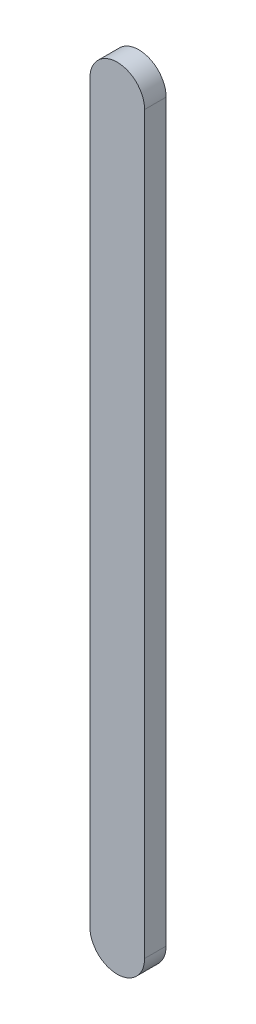
ISO-10303-21;
HEADER;
FILE_DESCRIPTION(('STEP AP214'),'2;1');
FILE_NAME('part.step','',(''),(''),'','','');
FILE_SCHEMA(('AUTOMOTIVE_DESIGN { 1 0 10303 214 1 1 1 1 }'));
ENDSEC;
DATA;
#1=APPLICATION_CONTEXT('core data for automotive mechanical design processes');
#2=APPLICATION_PROTOCOL_DEFINITION('international standard','automotive_design',2000,#1);
#3=PRODUCT_CONTEXT('',#1,'mechanical');
#4=PRODUCT('Part','Part','',(#3));
#5=PRODUCT_RELATED_PRODUCT_CATEGORY('part','',(#4));
#6=PRODUCT_DEFINITION_FORMATION('','',#4);
#7=PRODUCT_DEFINITION_CONTEXT('part definition',#1,'design');
#8=PRODUCT_DEFINITION('design','',#6,#7);
#9=PRODUCT_DEFINITION_SHAPE('','',#8);
#10=(LENGTH_UNIT() NAMED_UNIT(*) SI_UNIT(.MILLI.,.METRE.));
#11=(NAMED_UNIT(*) PLANE_ANGLE_UNIT() SI_UNIT($,.RADIAN.));
#12=(NAMED_UNIT(*) SI_UNIT($,.STERADIAN.) SOLID_ANGLE_UNIT());
#13=UNCERTAINTY_MEASURE_WITH_UNIT(LENGTH_MEASURE(1.E-05),#10,'distance_accuracy_value','');
#14=(GEOMETRIC_REPRESENTATION_CONTEXT(3) GLOBAL_UNCERTAINTY_ASSIGNED_CONTEXT((#13)) GLOBAL_UNIT_ASSIGNED_CONTEXT((#10,
#11,#12)) REPRESENTATION_CONTEXT('',''));
#15=CARTESIAN_POINT('',(0.,0.,0.));
#16=DIRECTION('',(0.,0.,1.));
#17=DIRECTION('',(1.,0.,0.));
#18=AXIS2_PLACEMENT_3D('',#15,#16,#17);
#19=CARTESIAN_POINT('',(91.8972,68.8142896,0.));
#20=DIRECTION('',(-1.,0.,0.));
#21=DIRECTION('',(0.,1.,0.));
#22=AXIS2_PLACEMENT_3D('',#19,#20,#21);
#23=PLANE('',#22);
#24=DIRECTION('',(0.,1.,0.));
#25=VECTOR('',#24,1.);
#26=CARTESIAN_POINT('',(91.8972,68.8142896,0.1999996));
#27=LINE('',#26,#25);
#28=CARTESIAN_POINT('',(91.8972,68.8142896,0.1999996));
#29=VERTEX_POINT('',#28);
#30=CARTESIAN_POINT('',(91.8972,75.6412,0.1999996));
#31=VERTEX_POINT('',#30);
#32=EDGE_CURVE('E11',#29,#31,#27,.T.);
#33=ORIENTED_EDGE('',*,*,#32,.F.);
#34=DIRECTION('',(0.,0.,1.));
#35=VECTOR('',#34,1.);
#36=CARTESIAN_POINT('',(91.8972,68.8142896,0.));
#37=LINE('',#36,#35);
#38=CARTESIAN_POINT('',(91.8972,68.8142896,0.));
#39=VERTEX_POINT('',#38);
#40=EDGE_CURVE('E24',#39,#29,#37,.T.);
#41=ORIENTED_EDGE('',*,*,#40,.F.);
#42=DIRECTION('',(0.,1.,0.));
#43=VECTOR('',#42,1.);
#44=CARTESIAN_POINT('',(91.8972,68.8142896,0.));
#45=LINE('',#44,#43);
#46=CARTESIAN_POINT('',(91.8972,75.6412,0.));
#47=VERTEX_POINT('',#46);
#48=EDGE_CURVE('E75',#39,#47,#45,.T.);
#49=ORIENTED_EDGE('',*,*,#48,.T.);
#50=DIRECTION('',(0.,0.,1.));
#51=VECTOR('',#50,1.);
#52=CARTESIAN_POINT('',(91.8972,75.6412,0.));
#53=LINE('',#52,#51);
#54=EDGE_CURVE('E37',#47,#31,#53,.T.);
#55=ORIENTED_EDGE('',*,*,#54,.T.);
#56=EDGE_LOOP('',(#33,#41,#49,#55));
#57=FACE_BOUND('',#56,.T.);
#58=ADVANCED_FACE('F17',(#57),#23,.F.);
#59=CARTESIAN_POINT('',(91.6432,75.6412,0.));
#60=DIRECTION('',(0.,0.,-1.));
#61=DIRECTION('',(1.,0.,0.));
#62=AXIS2_PLACEMENT_3D('',#59,#60,#61);
#63=CYLINDRICAL_SURFACE('',#62,0.253999999999995);
#64=CARTESIAN_POINT('',(91.6432,75.6412,0.1999996));
#65=DIRECTION('',(0.,0.,1.));
#66=DIRECTION('',(1.,0.,0.));
#67=AXIS2_PLACEMENT_3D('',#64,#65,#66);
#68=CIRCLE('',#67,0.253999999999995);
#69=CARTESIAN_POINT('',(91.3892,75.6412,0.1999996));
#70=VERTEX_POINT('',#69);
#71=EDGE_CURVE('E83',#31,#70,#68,.T.);
#72=ORIENTED_EDGE('',*,*,#71,.F.);
#73=ORIENTED_EDGE('',*,*,#54,.F.);
#74=CARTESIAN_POINT('',(91.6432,75.6412,0.));
#75=DIRECTION('',(0.,0.,1.));
#76=DIRECTION('',(1.,0.,0.));
#77=AXIS2_PLACEMENT_3D('',#74,#75,#76);
#78=CIRCLE('',#77,0.253999999999995);
#79=CARTESIAN_POINT('',(91.3892,75.6412,0.));
#80=VERTEX_POINT('',#79);
#81=EDGE_CURVE('E81',#47,#80,#78,.T.);
#82=ORIENTED_EDGE('',*,*,#81,.T.);
#83=DIRECTION('',(0.,0.,1.));
#84=VECTOR('',#83,1.);
#85=CARTESIAN_POINT('',(91.3892,75.6412,0.));
#86=LINE('',#85,#84);
#87=EDGE_CURVE('E67',#80,#70,#86,.T.);
#88=ORIENTED_EDGE('',*,*,#87,.T.);
#89=EDGE_LOOP('',(#72,#73,#82,#88));
#90=FACE_BOUND('',#89,.T.);
#91=ADVANCED_FACE('F89',(#90),#63,.T.);
#92=CARTESIAN_POINT('',(91.3892,75.6412,0.));
#93=DIRECTION('',(1.,0.,0.));
#94=DIRECTION('',(0.,-1.,0.));
#95=AXIS2_PLACEMENT_3D('',#92,#93,#94);
#96=PLANE('',#95);
#97=DIRECTION('',(0.,-1.,0.));
#98=VECTOR('',#97,1.);
#99=CARTESIAN_POINT('',(91.3892,75.6412,0.1999996));
#100=LINE('',#99,#98);
#101=CARTESIAN_POINT('',(91.3892,68.8142896,0.1999996));
#102=VERTEX_POINT('',#101);
#103=EDGE_CURVE('E71',#70,#102,#100,.T.);
#104=ORIENTED_EDGE('',*,*,#103,.F.);
#105=ORIENTED_EDGE('',*,*,#87,.F.);
#106=DIRECTION('',(0.,-1.,0.));
#107=VECTOR('',#106,1.);
#108=CARTESIAN_POINT('',(91.3892,75.6412,0.));
#109=LINE('',#108,#107);
#110=CARTESIAN_POINT('',(91.3892,68.8142896,0.));
#111=VERTEX_POINT('',#110);
#112=EDGE_CURVE('E63',#80,#111,#109,.T.);
#113=ORIENTED_EDGE('',*,*,#112,.T.);
#114=DIRECTION('',(0.,0.,1.));
#115=VECTOR('',#114,1.);
#116=CARTESIAN_POINT('',(91.3892,68.8142896,0.));
#117=LINE('',#116,#115);
#118=EDGE_CURVE('E53',#111,#102,#117,.T.);
#119=ORIENTED_EDGE('',*,*,#118,.T.);
#120=EDGE_LOOP('',(#104,#105,#113,#119));
#121=FACE_BOUND('',#120,.T.);
#122=ADVANCED_FACE('F66',(#121),#96,.F.);
#123=CARTESIAN_POINT('',(91.6432,68.8142896,0.));
#124=DIRECTION('',(0.,0.,-1.));
#125=DIRECTION('',(-1.,0.,0.));
#126=AXIS2_PLACEMENT_3D('',#123,#124,#125);
#127=CYLINDRICAL_SURFACE('',#126,0.253999999999995);
#128=CARTESIAN_POINT('',(91.6432,68.8142896,0.1999996));
#129=DIRECTION('',(0.,0.,1.));
#130=DIRECTION('',(-1.,0.,0.));
#131=AXIS2_PLACEMENT_3D('',#128,#129,#130);
#132=CIRCLE('',#131,0.253999999999995);
#133=EDGE_CURVE('E59',#102,#29,#132,.T.);
#134=ORIENTED_EDGE('',*,*,#133,.F.);
#135=ORIENTED_EDGE('',*,*,#118,.F.);
#136=CARTESIAN_POINT('',(91.6432,68.8142896,0.));
#137=DIRECTION('',(0.,0.,1.));
#138=DIRECTION('',(-1.,0.,0.));
#139=AXIS2_PLACEMENT_3D('',#136,#137,#138);
#140=CIRCLE('',#139,0.253999999999995);
#141=EDGE_CURVE('E57',#111,#39,#140,.T.);
#142=ORIENTED_EDGE('',*,*,#141,.T.);
#143=ORIENTED_EDGE('',*,*,#40,.T.);
#144=EDGE_LOOP('',(#134,#135,#142,#143));
#145=FACE_BOUND('',#144,.T.);
#146=ADVANCED_FACE('F55',(#145),#127,.T.);
#147=CARTESIAN_POINT('',(91.8972,68.8142896,0.));
#148=DIRECTION('',(0.,0.,-1.));
#149=DIRECTION('',(-1.,0.,0.));
#150=AXIS2_PLACEMENT_3D('',#147,#148,#149);
#151=PLANE('',#150);
#152=ORIENTED_EDGE('',*,*,#141,.F.);
#153=ORIENTED_EDGE('',*,*,#112,.F.);
#154=ORIENTED_EDGE('',*,*,#81,.F.);
#155=ORIENTED_EDGE('',*,*,#48,.F.);
#156=EDGE_LOOP('',(#152,#153,#154,#155));
#157=FACE_BOUND('',#156,.T.);
#158=ADVANCED_FACE('F74',(#157),#151,.T.);
#159=CARTESIAN_POINT('',(91.8972,68.8142896,0.1999996));
#160=DIRECTION('',(0.,0.,-1.));
#161=DIRECTION('',(-1.,0.,0.));
#162=AXIS2_PLACEMENT_3D('',#159,#160,#161);
#163=PLANE('',#162);
#164=ORIENTED_EDGE('',*,*,#32,.T.);
#165=ORIENTED_EDGE('',*,*,#71,.T.);
#166=ORIENTED_EDGE('',*,*,#103,.T.);
#167=ORIENTED_EDGE('',*,*,#133,.T.);
#168=EDGE_LOOP('',(#164,#165,#166,#167));
#169=FACE_BOUND('',#168,.T.);
#170=ADVANCED_FACE('F91',(#169),#163,.F.);
#171=CLOSED_SHELL('',(#58,#91,#122,#146,#158,#170));
#172=MANIFOLD_SOLID_BREP('B1',#171);
#173=ADVANCED_BREP_SHAPE_REPRESENTATION('',(#18,#172),#14);
#174=SHAPE_DEFINITION_REPRESENTATION(#9,#173);
ENDSEC;
END-ISO-10303-21;
